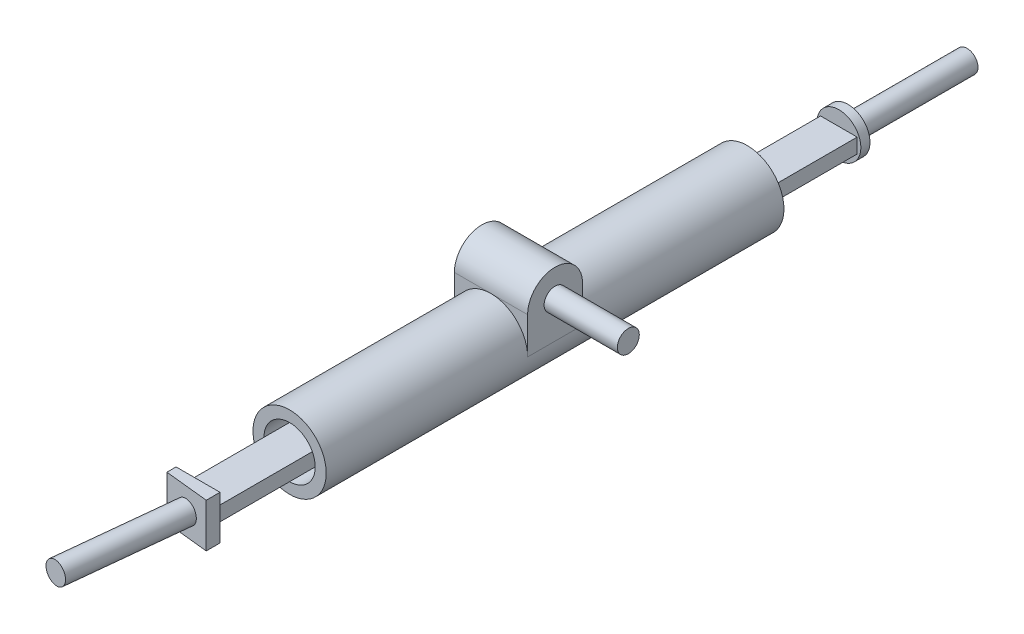
ISO-10303-21;
HEADER;
FILE_DESCRIPTION(('STEP AP214'),'2;1');
FILE_NAME('part.step','',(''),(''),'','','');
FILE_SCHEMA(('AUTOMOTIVE_DESIGN { 1 0 10303 214 1 1 1 1 }'));
ENDSEC;
DATA;
#1=APPLICATION_CONTEXT('core data for automotive mechanical design processes');
#2=APPLICATION_PROTOCOL_DEFINITION('international standard','automotive_design',2000,#1);
#3=PRODUCT_CONTEXT('',#1,'mechanical');
#4=PRODUCT('Part','Part','',(#3));
#5=PRODUCT_RELATED_PRODUCT_CATEGORY('part','',(#4));
#6=PRODUCT_DEFINITION_FORMATION('','',#4);
#7=PRODUCT_DEFINITION_CONTEXT('part definition',#1,'design');
#8=PRODUCT_DEFINITION('design','',#6,#7);
#9=PRODUCT_DEFINITION_SHAPE('','',#8);
#10=(LENGTH_UNIT() NAMED_UNIT(*) SI_UNIT(.MILLI.,.METRE.));
#11=(NAMED_UNIT(*) PLANE_ANGLE_UNIT() SI_UNIT($,.RADIAN.));
#12=(NAMED_UNIT(*) SI_UNIT($,.STERADIAN.) SOLID_ANGLE_UNIT());
#13=UNCERTAINTY_MEASURE_WITH_UNIT(LENGTH_MEASURE(1.E-05),#10,'distance_accuracy_value','');
#14=(GEOMETRIC_REPRESENTATION_CONTEXT(3) GLOBAL_UNCERTAINTY_ASSIGNED_CONTEXT((#13)) GLOBAL_UNIT_ASSIGNED_CONTEXT((#10,
#11,#12)) REPRESENTATION_CONTEXT('',''));
#15=CARTESIAN_POINT('',(0.,0.,0.));
#16=DIRECTION('',(0.,0.,1.));
#17=DIRECTION('',(1.,0.,0.));
#18=AXIS2_PLACEMENT_3D('',#15,#16,#17);
#19=CARTESIAN_POINT('',(-20.,0.,0.));
#20=DIRECTION('',(-1.,0.,0.));
#21=DIRECTION('',(0.,0.,1.));
#22=AXIS2_PLACEMENT_3D('',#19,#20,#21);
#23=PLANE('',#22);
#24=CARTESIAN_POINT('',(-20.,20.,175.));
#25=DIRECTION('',(1.,0.,0.));
#26=DIRECTION('',(0.,0.,-1.));
#27=AXIS2_PLACEMENT_3D('',#24,#25,#26);
#28=CIRCLE('',#27,15.);
#29=CARTESIAN_POINT('',(-20.,20.,160.));
#30=VERTEX_POINT('',#29);
#31=CARTESIAN_POINT('',(-20.,20.,190.));
#32=VERTEX_POINT('',#31);
#33=EDGE_CURVE('E162',#30,#32,#28,.T.);
#34=ORIENTED_EDGE('',*,*,#33,.F.);
#35=DIRECTION('',(0.,-1.,0.));
#36=VECTOR('',#35,1.);
#37=CARTESIAN_POINT('',(-20.,35.,160.));
#38=LINE('',#37,#36);
#39=CARTESIAN_POINT('',(-20.,0.,160.));
#40=VERTEX_POINT('',#39);
#41=EDGE_CURVE('E166',#30,#40,#38,.T.);
#42=ORIENTED_EDGE('',*,*,#41,.T.);
#43=DIRECTION('',(0.,0.,1.));
#44=VECTOR('',#43,1.);
#45=CARTESIAN_POINT('',(-20.,0.,160.));
#46=LINE('',#45,#44);
#47=CARTESIAN_POINT('',(-20.,0.,190.));
#48=VERTEX_POINT('',#47);
#49=EDGE_CURVE('E184',#40,#48,#46,.T.);
#50=ORIENTED_EDGE('',*,*,#49,.T.);
#51=DIRECTION('',(0.,1.,0.));
#52=VECTOR('',#51,1.);
#53=CARTESIAN_POINT('',(-20.,0.,190.));
#54=LINE('',#53,#52);
#55=EDGE_CURVE('E169',#48,#32,#54,.T.);
#56=ORIENTED_EDGE('',*,*,#55,.T.);
#57=EDGE_LOOP('',(#34,#42,#50,#56));
#58=FACE_BOUND('',#57,.T.);
#59=ADVANCED_FACE('F32',(#58),#23,.T.);
#60=CARTESIAN_POINT('',(20.,0.,0.));
#61=DIRECTION('',(-1.,0.,0.));
#62=DIRECTION('',(0.,0.,1.));
#63=AXIS2_PLACEMENT_3D('',#60,#61,#62);
#64=PLANE('',#63);
#65=CARTESIAN_POINT('',(20.,20.,175.));
#66=DIRECTION('',(-1.,0.,0.));
#67=DIRECTION('',(0.,0.,1.));
#68=AXIS2_PLACEMENT_3D('',#65,#66,#67);
#69=CIRCLE('',#68,6.00000000000002);
#70=CARTESIAN_POINT('',(20.,20.,181.));
#71=VERTEX_POINT('',#70);
#72=EDGE_CURVE('E11',#71,#71,#69,.F.);
#73=ORIENTED_EDGE('',*,*,#72,.F.);
#74=EDGE_LOOP('',(#73));
#75=FACE_BOUND('',#74,.T.);
#76=DIRECTION('',(0.,-1.,0.));
#77=VECTOR('',#76,1.);
#78=CARTESIAN_POINT('',(20.,35.,160.));
#79=LINE('',#78,#77);
#80=CARTESIAN_POINT('',(20.,20.,160.));
#81=VERTEX_POINT('',#80);
#82=CARTESIAN_POINT('',(20.,0.,160.));
#83=VERTEX_POINT('',#82);
#84=EDGE_CURVE('E316',#81,#83,#79,.T.);
#85=ORIENTED_EDGE('',*,*,#84,.F.);
#86=CARTESIAN_POINT('',(20.,20.,175.));
#87=DIRECTION('',(1.,0.,0.));
#88=DIRECTION('',(0.,0.,-1.));
#89=AXIS2_PLACEMENT_3D('',#86,#87,#88);
#90=CIRCLE('',#89,15.);
#91=CARTESIAN_POINT('',(20.,20.,190.));
#92=VERTEX_POINT('',#91);
#93=EDGE_CURVE('E170',#81,#92,#90,.T.);
#94=ORIENTED_EDGE('',*,*,#93,.T.);
#95=DIRECTION('',(0.,1.,0.));
#96=VECTOR('',#95,1.);
#97=CARTESIAN_POINT('',(20.,0.,190.));
#98=LINE('',#97,#96);
#99=CARTESIAN_POINT('',(20.,0.,190.));
#100=VERTEX_POINT('',#99);
#101=EDGE_CURVE('E185',#100,#92,#98,.T.);
#102=ORIENTED_EDGE('',*,*,#101,.F.);
#103=DIRECTION('',(0.,0.,1.));
#104=VECTOR('',#103,1.);
#105=CARTESIAN_POINT('',(20.,0.,160.));
#106=LINE('',#105,#104);
#107=EDGE_CURVE('E189',#83,#100,#106,.T.);
#108=ORIENTED_EDGE('',*,*,#107,.F.);
#109=EDGE_LOOP('',(#85,#94,#102,#108));
#110=FACE_BOUND('',#109,.T.);
#111=ADVANCED_FACE('F322',(#75,#110),#64,.F.);
#112=CARTESIAN_POINT('',(-20.,35.,160.));
#113=DIRECTION('',(0.,0.,1.));
#114=DIRECTION('',(1.,0.,0.));
#115=AXIS2_PLACEMENT_3D('',#112,#113,#114);
#116=PLANE('',#115);
#117=ORIENTED_EDGE('',*,*,#41,.F.);
#118=DIRECTION('',(1.,0.,0.));
#119=VECTOR('',#118,1.);
#120=CARTESIAN_POINT('',(-20.,20.,160.));
#121=LINE('',#120,#119);
#122=CARTESIAN_POINT('',(0.,20.,160.));
#123=VERTEX_POINT('',#122);
#124=EDGE_CURVE('E173',#30,#123,#121,.T.);
#125=ORIENTED_EDGE('',*,*,#124,.T.);
#126=CARTESIAN_POINT('',(0.,0.,160.));
#127=DIRECTION('',(0.,0.,1.));
#128=DIRECTION('',(1.,0.,0.));
#129=AXIS2_PLACEMENT_3D('',#126,#127,#128);
#130=CIRCLE('',#129,20.);
#131=EDGE_CURVE('E182',#40,#123,#130,.F.);
#132=ORIENTED_EDGE('',*,*,#131,.F.);
#133=EDGE_LOOP('',(#117,#125,#132));
#134=FACE_BOUND('',#133,.T.);
#135=ADVANCED_FACE('F180',(#134),#116,.F.);
#136=CARTESIAN_POINT('',(-20.,0.,190.));
#137=DIRECTION('',(0.,0.,-1.));
#138=DIRECTION('',(-1.,0.,0.));
#139=AXIS2_PLACEMENT_3D('',#136,#137,#138);
#140=PLANE('',#139);
#141=DIRECTION('',(1.,0.,0.));
#142=VECTOR('',#141,1.);
#143=CARTESIAN_POINT('',(-20.,20.,190.));
#144=LINE('',#143,#142);
#145=CARTESIAN_POINT('',(0.,20.,190.));
#146=VERTEX_POINT('',#145);
#147=EDGE_CURVE('E47',#32,#146,#144,.T.);
#148=ORIENTED_EDGE('',*,*,#147,.F.);
#149=ORIENTED_EDGE('',*,*,#55,.F.);
#150=CARTESIAN_POINT('',(0.,0.,190.));
#151=DIRECTION('',(0.,0.,-1.));
#152=DIRECTION('',(-1.,0.,0.));
#153=AXIS2_PLACEMENT_3D('',#150,#151,#152);
#154=CIRCLE('',#153,20.);
#155=EDGE_CURVE('E337',#146,#48,#154,.F.);
#156=ORIENTED_EDGE('',*,*,#155,.F.);
#157=EDGE_LOOP('',(#148,#149,#156));
#158=FACE_BOUND('',#157,.T.);
#159=ADVANCED_FACE('F369',(#158),#140,.F.);
#160=DIRECTION('',(1.,0.,0.));
#161=VECTOR('',#160,1.);
#162=CARTESIAN_POINT('',(-20.,20.,190.));
#163=LINE('',#162,#161);
#164=EDGE_CURVE('E312',#146,#92,#163,.T.);
#165=ORIENTED_EDGE('',*,*,#164,.F.);
#166=EDGE_CURVE('E334',#100,#146,#154,.F.);
#167=ORIENTED_EDGE('',*,*,#166,.F.);
#168=ORIENTED_EDGE('',*,*,#101,.T.);
#169=EDGE_LOOP('',(#165,#167,#168));
#170=FACE_BOUND('',#169,.T.);
#171=ADVANCED_FACE('F379',(#170),#140,.F.);
#172=DIRECTION('',(1.,0.,0.));
#173=VECTOR('',#172,1.);
#174=CARTESIAN_POINT('',(-20.,0.,160.));
#175=LINE('',#174,#173);
#176=CARTESIAN_POINT('',(-14.,0.,160.));
#177=VERTEX_POINT('',#176);
#178=CARTESIAN_POINT('',(-10.,0.,160.));
#179=VERTEX_POINT('',#178);
#180=EDGE_CURVE('E198',#177,#179,#175,.T.);
#181=ORIENTED_EDGE('',*,*,#180,.F.);
#182=CARTESIAN_POINT('',(0.,0.,160.));
#183=DIRECTION('',(0.,0.,1.));
#184=DIRECTION('',(1.,0.,0.));
#185=AXIS2_PLACEMENT_3D('',#182,#183,#184);
#186=CIRCLE('',#185,14.);
#187=CARTESIAN_POINT('',(14.,0.,160.));
#188=VERTEX_POINT('',#187);
#189=EDGE_CURVE('E324',#177,#188,#186,.F.);
#190=ORIENTED_EDGE('',*,*,#189,.T.);
#191=CARTESIAN_POINT('',(10.,0.,160.));
#192=VERTEX_POINT('',#191);
#193=EDGE_CURVE('E197',#192,#188,#175,.T.);
#194=ORIENTED_EDGE('',*,*,#193,.F.);
#195=DIRECTION('',(0.,1.,0.));
#196=VECTOR('',#195,1.);
#197=CARTESIAN_POINT('',(10.,-4.,160.));
#198=LINE('',#197,#196);
#199=CARTESIAN_POINT('',(10.,4.,160.));
#200=VERTEX_POINT('',#199);
#201=EDGE_CURVE('E212',#192,#200,#198,.T.);
#202=ORIENTED_EDGE('',*,*,#201,.T.);
#203=DIRECTION('',(-1.,0.,0.));
#204=VECTOR('',#203,1.);
#205=CARTESIAN_POINT('',(-10.,4.,160.));
#206=LINE('',#205,#204);
#207=CARTESIAN_POINT('',(-10.,4.,160.));
#208=VERTEX_POINT('',#207);
#209=EDGE_CURVE('E209',#200,#208,#206,.T.);
#210=ORIENTED_EDGE('',*,*,#209,.T.);
#211=DIRECTION('',(0.,-1.,0.));
#212=VECTOR('',#211,1.);
#213=CARTESIAN_POINT('',(-10.,-4.,160.));
#214=LINE('',#213,#212);
#215=EDGE_CURVE('E307',#208,#179,#214,.T.);
#216=ORIENTED_EDGE('',*,*,#215,.T.);
#217=EDGE_LOOP('',(#181,#190,#194,#202,#210,#216));
#218=FACE_BOUND('',#217,.T.);
#219=ADVANCED_FACE('F371',(#218),#116,.F.);
#220=DIRECTION('',(1.,0.,0.));
#221=VECTOR('',#220,1.);
#222=CARTESIAN_POINT('',(-20.,0.,190.));
#223=LINE('',#222,#221);
#224=CARTESIAN_POINT('',(10.,0.,190.));
#225=VERTEX_POINT('',#224);
#226=CARTESIAN_POINT('',(14.,0.,190.));
#227=VERTEX_POINT('',#226);
#228=EDGE_CURVE('E194',#225,#227,#223,.T.);
#229=ORIENTED_EDGE('',*,*,#228,.T.);
#230=CARTESIAN_POINT('',(0.,0.,190.));
#231=DIRECTION('',(0.,0.,-1.));
#232=DIRECTION('',(-1.,0.,0.));
#233=AXIS2_PLACEMENT_3D('',#230,#231,#232);
#234=CIRCLE('',#233,14.);
#235=CARTESIAN_POINT('',(-14.,0.,190.));
#236=VERTEX_POINT('',#235);
#237=EDGE_CURVE('E310',#227,#236,#234,.F.);
#238=ORIENTED_EDGE('',*,*,#237,.T.);
#239=CARTESIAN_POINT('',(-10.,0.,190.));
#240=VERTEX_POINT('',#239);
#241=EDGE_CURVE('E195',#236,#240,#223,.T.);
#242=ORIENTED_EDGE('',*,*,#241,.T.);
#243=DIRECTION('',(0.,1.,0.));
#244=VECTOR('',#243,1.);
#245=CARTESIAN_POINT('',(-10.,-4.,190.));
#246=LINE('',#245,#244);
#247=CARTESIAN_POINT('',(-10.,4.,190.));
#248=VERTEX_POINT('',#247);
#249=EDGE_CURVE('E301',#240,#248,#246,.T.);
#250=ORIENTED_EDGE('',*,*,#249,.T.);
#251=DIRECTION('',(1.,0.,0.));
#252=VECTOR('',#251,1.);
#253=CARTESIAN_POINT('',(-10.,4.,190.));
#254=LINE('',#253,#252);
#255=CARTESIAN_POINT('',(10.,4.,190.));
#256=VERTEX_POINT('',#255);
#257=EDGE_CURVE('E200',#248,#256,#254,.T.);
#258=ORIENTED_EDGE('',*,*,#257,.T.);
#259=DIRECTION('',(0.,-1.,0.));
#260=VECTOR('',#259,1.);
#261=CARTESIAN_POINT('',(10.,-4.,190.));
#262=LINE('',#261,#260);
#263=EDGE_CURVE('E203',#256,#225,#262,.T.);
#264=ORIENTED_EDGE('',*,*,#263,.T.);
#265=EDGE_LOOP('',(#229,#238,#242,#250,#258,#264));
#266=FACE_BOUND('',#265,.T.);
#267=ADVANCED_FACE('F381',(#266),#140,.F.);
#268=CARTESIAN_POINT('',(10.,-4.,350.));
#269=DIRECTION('',(-1.,0.,0.));
#270=DIRECTION('',(0.,0.,1.));
#271=AXIS2_PLACEMENT_3D('',#268,#269,#270);
#272=PLANE('',#271);
#273=ORIENTED_EDGE('',*,*,#201,.F.);
#274=DIRECTION('',(0.,0.,-1.));
#275=VECTOR('',#274,1.);
#276=CARTESIAN_POINT('',(10.,0.,350.));
#277=LINE('',#276,#275);
#278=EDGE_CURVE('E206',#225,#192,#277,.T.);
#279=ORIENTED_EDGE('',*,*,#278,.F.);
#280=ORIENTED_EDGE('',*,*,#263,.F.);
#281=DIRECTION('',(0.,0.,-1.));
#282=VECTOR('',#281,1.);
#283=CARTESIAN_POINT('',(10.,4.,350.));
#284=LINE('',#283,#282);
#285=CARTESIAN_POINT('',(10.,4.,350.));
#286=VERTEX_POINT('',#285);
#287=EDGE_CURVE('E216',#286,#256,#284,.T.);
#288=ORIENTED_EDGE('',*,*,#287,.F.);
#289=DIRECTION('',(0.,1.,0.));
#290=VECTOR('',#289,1.);
#291=CARTESIAN_POINT('',(10.,-4.,350.));
#292=LINE('',#291,#290);
#293=CARTESIAN_POINT('',(10.,-4.,350.));
#294=VERTEX_POINT('',#293);
#295=EDGE_CURVE('E245',#294,#286,#292,.T.);
#296=ORIENTED_EDGE('',*,*,#295,.F.);
#297=DIRECTION('',(0.,0.,-1.));
#298=VECTOR('',#297,1.);
#299=CARTESIAN_POINT('',(10.,-4.,350.));
#300=LINE('',#299,#298);
#301=CARTESIAN_POINT('',(10.,-4.,0.));
#302=VERTEX_POINT('',#301);
#303=EDGE_CURVE('E229',#294,#302,#300,.T.);
#304=ORIENTED_EDGE('',*,*,#303,.T.);
#305=DIRECTION('',(0.,1.,0.));
#306=VECTOR('',#305,1.);
#307=CARTESIAN_POINT('',(10.,-4.,0.));
#308=LINE('',#307,#306);
#309=CARTESIAN_POINT('',(10.,4.,0.));
#310=VERTEX_POINT('',#309);
#311=EDGE_CURVE('E233',#302,#310,#308,.T.);
#312=ORIENTED_EDGE('',*,*,#311,.T.);
#313=EDGE_CURVE('E220',#200,#310,#284,.T.);
#314=ORIENTED_EDGE('',*,*,#313,.F.);
#315=EDGE_LOOP('',(#273,#279,#280,#288,#296,#304,#312,#314));
#316=FACE_BOUND('',#315,.T.);
#317=ADVANCED_FACE('F389',(#316),#272,.F.);
#318=CARTESIAN_POINT('',(-10.,4.,350.));
#319=DIRECTION('',(0.,-1.,0.));
#320=DIRECTION('',(0.,0.,-1.));
#321=AXIS2_PLACEMENT_3D('',#318,#319,#320);
#322=PLANE('',#321);
#323=ORIENTED_EDGE('',*,*,#209,.F.);
#324=ORIENTED_EDGE('',*,*,#313,.T.);
#325=DIRECTION('',(-1.,0.,0.));
#326=VECTOR('',#325,1.);
#327=CARTESIAN_POINT('',(-10.,4.,0.));
#328=LINE('',#327,#326);
#329=CARTESIAN_POINT('',(-10.,4.,0.));
#330=VERTEX_POINT('',#329);
#331=EDGE_CURVE('E232',#310,#330,#328,.T.);
#332=ORIENTED_EDGE('',*,*,#331,.T.);
#333=DIRECTION('',(0.,0.,-1.));
#334=VECTOR('',#333,1.);
#335=CARTESIAN_POINT('',(-10.,4.,350.));
#336=LINE('',#335,#334);
#337=EDGE_CURVE('E224',#208,#330,#336,.T.);
#338=ORIENTED_EDGE('',*,*,#337,.F.);
#339=EDGE_LOOP('',(#323,#324,#332,#338));
#340=FACE_BOUND('',#339,.T.);
#341=ADVANCED_FACE('F392',(#340),#322,.F.);
#342=ORIENTED_EDGE('',*,*,#257,.F.);
#343=CARTESIAN_POINT('',(-10.,4.,350.));
#344=VERTEX_POINT('',#343);
#345=EDGE_CURVE('E221',#344,#248,#336,.T.);
#346=ORIENTED_EDGE('',*,*,#345,.F.);
#347=DIRECTION('',(-1.,0.,0.));
#348=VECTOR('',#347,1.);
#349=CARTESIAN_POINT('',(-10.,4.,350.));
#350=LINE('',#349,#348);
#351=EDGE_CURVE('E250',#286,#344,#350,.T.);
#352=ORIENTED_EDGE('',*,*,#351,.F.);
#353=ORIENTED_EDGE('',*,*,#287,.T.);
#354=EDGE_LOOP('',(#342,#346,#352,#353));
#355=FACE_BOUND('',#354,.T.);
#356=ADVANCED_FACE('F396',(#355),#322,.F.);
#357=CARTESIAN_POINT('',(-10.,-4.,350.));
#358=DIRECTION('',(1.,0.,0.));
#359=DIRECTION('',(0.,0.,-1.));
#360=AXIS2_PLACEMENT_3D('',#357,#358,#359);
#361=PLANE('',#360);
#362=ORIENTED_EDGE('',*,*,#215,.F.);
#363=ORIENTED_EDGE('',*,*,#337,.T.);
#364=DIRECTION('',(0.,-1.,0.));
#365=VECTOR('',#364,1.);
#366=CARTESIAN_POINT('',(-10.,-4.,0.));
#367=LINE('',#366,#365);
#368=CARTESIAN_POINT('',(-10.,-4.,0.));
#369=VERTEX_POINT('',#368);
#370=EDGE_CURVE('E219',#330,#369,#367,.T.);
#371=ORIENTED_EDGE('',*,*,#370,.T.);
#372=DIRECTION('',(0.,0.,-1.));
#373=VECTOR('',#372,1.);
#374=CARTESIAN_POINT('',(-10.,-4.,350.));
#375=LINE('',#374,#373);
#376=CARTESIAN_POINT('',(-10.,-4.,350.));
#377=VERTEX_POINT('',#376);
#378=EDGE_CURVE('E225',#377,#369,#375,.T.);
#379=ORIENTED_EDGE('',*,*,#378,.F.);
#380=DIRECTION('',(0.,-1.,0.));
#381=VECTOR('',#380,1.);
#382=CARTESIAN_POINT('',(-10.,-4.,350.));
#383=LINE('',#382,#381);
#384=EDGE_CURVE('E246',#344,#377,#383,.T.);
#385=ORIENTED_EDGE('',*,*,#384,.F.);
#386=ORIENTED_EDGE('',*,*,#345,.T.);
#387=ORIENTED_EDGE('',*,*,#249,.F.);
#388=DIRECTION('',(0.,0.,1.));
#389=VECTOR('',#388,1.);
#390=CARTESIAN_POINT('',(-10.,0.,350.));
#391=LINE('',#390,#389);
#392=EDGE_CURVE('E304',#179,#240,#391,.T.);
#393=ORIENTED_EDGE('',*,*,#392,.F.);
#394=EDGE_LOOP('',(#362,#363,#371,#379,#385,#386,#387,#393));
#395=FACE_BOUND('',#394,.T.);
#396=ADVANCED_FACE('F398',(#395),#361,.F.);
#397=CARTESIAN_POINT('',(0.,0.,350.));
#398=DIRECTION('',(0.,0.,1.));
#399=DIRECTION('',(1.,0.,0.));
#400=AXIS2_PLACEMENT_3D('',#397,#398,#399);
#401=PLANE('',#400);
#402=DIRECTION('',(1.,0.,0.));
#403=VECTOR('',#402,1.);
#404=CARTESIAN_POINT('',(-10.,-4.,350.));
#405=LINE('',#404,#403);
#406=EDGE_CURVE('E215',#377,#294,#405,.T.);
#407=ORIENTED_EDGE('',*,*,#406,.T.);
#408=ORIENTED_EDGE('',*,*,#295,.T.);
#409=ORIENTED_EDGE('',*,*,#351,.T.);
#410=ORIENTED_EDGE('',*,*,#384,.T.);
#411=EDGE_LOOP('',(#407,#408,#409,#410));
#412=FACE_BOUND('',#411,.T.);
#413=DIRECTION('',(-1.,0.,0.));
#414=VECTOR('',#413,1.);
#415=CARTESIAN_POINT('',(-12.,12.,350.));
#416=LINE('',#415,#414);
#417=CARTESIAN_POINT('',(12.,12.,350.));
#418=VERTEX_POINT('',#417);
#419=CARTESIAN_POINT('',(-12.,12.,350.));
#420=VERTEX_POINT('',#419);
#421=EDGE_CURVE('E279',#418,#420,#416,.T.);
#422=ORIENTED_EDGE('',*,*,#421,.F.);
#423=DIRECTION('',(0.,1.,0.));
#424=VECTOR('',#423,1.);
#425=CARTESIAN_POINT('',(12.,-12.,350.));
#426=LINE('',#425,#424);
#427=CARTESIAN_POINT('',(12.,-12.,350.));
#428=VERTEX_POINT('',#427);
#429=EDGE_CURVE('E267',#428,#418,#426,.T.);
#430=ORIENTED_EDGE('',*,*,#429,.F.);
#431=DIRECTION('',(-1.,0.,0.));
#432=VECTOR('',#431,1.);
#433=CARTESIAN_POINT('',(-12.,-12.,350.));
#434=LINE('',#433,#432);
#435=CARTESIAN_POINT('',(-12.,-12.,350.));
#436=VERTEX_POINT('',#435);
#437=EDGE_CURVE('E249',#428,#436,#434,.T.);
#438=ORIENTED_EDGE('',*,*,#437,.T.);
#439=DIRECTION('',(0.,1.,0.));
#440=VECTOR('',#439,1.);
#441=CARTESIAN_POINT('',(-12.,-12.,350.));
#442=LINE('',#441,#440);
#443=EDGE_CURVE('E242',#436,#420,#442,.T.);
#444=ORIENTED_EDGE('',*,*,#443,.T.);
#445=EDGE_LOOP('',(#422,#430,#438,#444));
#446=FACE_BOUND('',#445,.T.);
#447=ADVANCED_FACE('F401',(#412,#446),#401,.F.);
#448=CARTESIAN_POINT('',(-10.,-4.,350.));
#449=DIRECTION('',(0.,1.,0.));
#450=DIRECTION('',(0.,0.,1.));
#451=AXIS2_PLACEMENT_3D('',#448,#449,#450);
#452=PLANE('',#451);
#453=DIRECTION('',(1.,0.,0.));
#454=VECTOR('',#453,1.);
#455=CARTESIAN_POINT('',(-10.,-4.,0.));
#456=LINE('',#455,#454);
#457=EDGE_CURVE('E223',#369,#302,#456,.T.);
#458=ORIENTED_EDGE('',*,*,#457,.T.);
#459=ORIENTED_EDGE('',*,*,#303,.F.);
#460=ORIENTED_EDGE('',*,*,#406,.F.);
#461=ORIENTED_EDGE('',*,*,#378,.T.);
#462=EDGE_LOOP('',(#458,#459,#460,#461));
#463=FACE_BOUND('',#462,.T.);
#464=ADVANCED_FACE('F403',(#463),#452,.F.);
#465=CARTESIAN_POINT('',(0.,0.,-5.));
#466=DIRECTION('',(0.,0.,1.));
#467=DIRECTION('',(1.,0.,0.));
#468=AXIS2_PLACEMENT_3D('',#465,#466,#467);
#469=CYLINDRICAL_SURFACE('',#468,12.);
#470=CARTESIAN_POINT('',(0.,0.,-5.));
#471=DIRECTION('',(0.,0.,-1.));
#472=DIRECTION('',(-1.,0.,0.));
#473=AXIS2_PLACEMENT_3D('',#470,#471,#472);
#474=CIRCLE('',#473,12.);
#475=CARTESIAN_POINT('',(-12.,0.,-5.));
#476=VERTEX_POINT('',#475);
#477=EDGE_CURVE('E257',#476,#476,#474,.T.);
#478=ORIENTED_EDGE('',*,*,#477,.F.);
#479=EDGE_LOOP('',(#478));
#480=FACE_BOUND('',#479,.T.);
#481=CARTESIAN_POINT('',(0.,0.,0.));
#482=DIRECTION('',(0.,0.,-1.));
#483=DIRECTION('',(-1.,0.,0.));
#484=AXIS2_PLACEMENT_3D('',#481,#482,#483);
#485=CIRCLE('',#484,12.);
#486=CARTESIAN_POINT('',(-12.,0.,0.));
#487=VERTEX_POINT('',#486);
#488=EDGE_CURVE('E228',#487,#487,#485,.T.);
#489=ORIENTED_EDGE('',*,*,#488,.T.);
#490=EDGE_LOOP('',(#489));
#491=FACE_BOUND('',#490,.T.);
#492=ADVANCED_FACE('F406',(#480,#491),#469,.T.);
#493=CARTESIAN_POINT('',(0.,0.,-5.));
#494=DIRECTION('',(0.,0.,-1.));
#495=DIRECTION('',(-1.,0.,0.));
#496=AXIS2_PLACEMENT_3D('',#493,#494,#495);
#497=PLANE('',#496);
#498=CARTESIAN_POINT('',(0.,0.,-5.));
#499=DIRECTION('',(0.,0.,-1.));
#500=DIRECTION('',(-1.,0.,0.));
#501=AXIS2_PLACEMENT_3D('',#498,#499,#500);
#502=CIRCLE('',#501,6.);
#503=CARTESIAN_POINT('',(-6.,0.,-5.));
#504=VERTEX_POINT('',#503);
#505=EDGE_CURVE('E295',#504,#504,#502,.T.);
#506=ORIENTED_EDGE('',*,*,#505,.F.);
#507=EDGE_LOOP('',(#506));
#508=FACE_BOUND('',#507,.T.);
#509=ORIENTED_EDGE('',*,*,#477,.T.);
#510=EDGE_LOOP('',(#509));
#511=FACE_BOUND('',#510,.T.);
#512=ADVANCED_FACE('F413',(#508,#511),#497,.T.);
#513=CARTESIAN_POINT('',(0.,0.,0.));
#514=DIRECTION('',(0.,0.,-1.));
#515=DIRECTION('',(-1.,0.,0.));
#516=AXIS2_PLACEMENT_3D('',#513,#514,#515);
#517=PLANE('',#516);
#518=ORIENTED_EDGE('',*,*,#311,.F.);
#519=ORIENTED_EDGE('',*,*,#457,.F.);
#520=ORIENTED_EDGE('',*,*,#370,.F.);
#521=ORIENTED_EDGE('',*,*,#331,.F.);
#522=EDGE_LOOP('',(#518,#519,#520,#521));
#523=FACE_BOUND('',#522,.T.);
#524=ORIENTED_EDGE('',*,*,#488,.F.);
#525=EDGE_LOOP('',(#524));
#526=FACE_BOUND('',#525,.T.);
#527=ADVANCED_FACE('F415',(#523,#526),#517,.F.);
#528=CARTESIAN_POINT('',(-12.,-12.,350.));
#529=DIRECTION('',(-1.,0.,0.));
#530=DIRECTION('',(0.,0.,1.));
#531=AXIS2_PLACEMENT_3D('',#528,#529,#530);
#532=PLANE('',#531);
#533=ORIENTED_EDGE('',*,*,#443,.F.);
#534=DIRECTION('',(0.,0.,1.));
#535=VECTOR('',#534,1.);
#536=CARTESIAN_POINT('',(-12.,-12.,350.));
#537=LINE('',#536,#535);
#538=CARTESIAN_POINT('',(-12.,-12.,355.));
#539=VERTEX_POINT('',#538);
#540=EDGE_CURVE('E260',#436,#539,#537,.T.);
#541=ORIENTED_EDGE('',*,*,#540,.T.);
#542=DIRECTION('',(0.,1.,0.));
#543=VECTOR('',#542,1.);
#544=CARTESIAN_POINT('',(-12.,-12.,355.));
#545=LINE('',#544,#543);
#546=CARTESIAN_POINT('',(-12.,12.,355.));
#547=VERTEX_POINT('',#546);
#548=EDGE_CURVE('E261',#539,#547,#545,.T.);
#549=ORIENTED_EDGE('',*,*,#548,.T.);
#550=DIRECTION('',(0.,0.,1.));
#551=VECTOR('',#550,1.);
#552=CARTESIAN_POINT('',(-12.,12.,350.));
#553=LINE('',#552,#551);
#554=EDGE_CURVE('E281',#420,#547,#553,.T.);
#555=ORIENTED_EDGE('',*,*,#554,.F.);
#556=EDGE_LOOP('',(#533,#541,#549,#555));
#557=FACE_BOUND('',#556,.T.);
#558=ADVANCED_FACE('F418',(#557),#532,.T.);
#559=CARTESIAN_POINT('',(12.,-12.,350.));
#560=DIRECTION('',(1.,0.,0.));
#561=DIRECTION('',(0.,0.,-1.));
#562=AXIS2_PLACEMENT_3D('',#559,#560,#561);
#563=PLANE('',#562);
#564=DIRECTION('',(0.,0.,-1.));
#565=VECTOR('',#564,1.);
#566=CARTESIAN_POINT('',(12.,-12.,350.));
#567=LINE('',#566,#565);
#568=CARTESIAN_POINT('',(12.,-12.,357.522501646376));
#569=VERTEX_POINT('',#568);
#570=EDGE_CURVE('E263',#569,#428,#567,.T.);
#571=ORIENTED_EDGE('',*,*,#570,.T.);
#572=ORIENTED_EDGE('',*,*,#429,.T.);
#573=DIRECTION('',(0.,0.,-1.));
#574=VECTOR('',#573,1.);
#575=CARTESIAN_POINT('',(12.,12.,350.));
#576=LINE('',#575,#574);
#577=CARTESIAN_POINT('',(12.,12.,357.522501646376));
#578=VERTEX_POINT('',#577);
#579=EDGE_CURVE('E276',#578,#418,#576,.T.);
#580=ORIENTED_EDGE('',*,*,#579,.F.);
#581=DIRECTION('',(0.,1.,0.));
#582=VECTOR('',#581,1.);
#583=CARTESIAN_POINT('',(12.,-12.,357.522501646376));
#584=LINE('',#583,#582);
#585=EDGE_CURVE('E264',#569,#578,#584,.T.);
#586=ORIENTED_EDGE('',*,*,#585,.F.);
#587=EDGE_LOOP('',(#571,#572,#580,#586));
#588=FACE_BOUND('',#587,.T.);
#589=ADVANCED_FACE('F425',(#588),#563,.T.);
#590=CARTESIAN_POINT('',(-12.,-12.,355.));
#591=DIRECTION('',(-0.104528463267654,0.,0.994521895368273));
#592=DIRECTION('',(0.994521895368273,0.,0.104528463267654));
#593=AXIS2_PLACEMENT_3D('',#590,#591,#592);
#594=PLANE('',#593);
#595=CARTESIAN_POINT('',(0.,0.,356.261250823188));
#596=DIRECTION('',(-0.104528463267654,0.,0.994521895368273));
#597=DIRECTION('',(0.994521895368273,0.,0.104528463267654));
#598=AXIS2_PLACEMENT_3D('',#595,#596,#597);
#599=CIRCLE('',#598,6.);
#600=CARTESIAN_POINT('',(-5.96713137220964,0.,355.634080043582));
#601=VERTEX_POINT('',#600);
#602=EDGE_CURVE('E287',#601,#601,#599,.T.);
#603=ORIENTED_EDGE('',*,*,#602,.F.);
#604=EDGE_LOOP('',(#603));
#605=FACE_BOUND('',#604,.T.);
#606=ORIENTED_EDGE('',*,*,#585,.T.);
#607=DIRECTION('',(0.994521895368273,0.,0.104528463267654));
#608=VECTOR('',#607,1.);
#609=CARTESIAN_POINT('',(-12.,12.,355.));
#610=LINE('',#609,#608);
#611=EDGE_CURVE('E284',#547,#578,#610,.T.);
#612=ORIENTED_EDGE('',*,*,#611,.F.);
#613=ORIENTED_EDGE('',*,*,#548,.F.);
#614=DIRECTION('',(0.994521895368273,0.,0.104528463267654));
#615=VECTOR('',#614,1.);
#616=CARTESIAN_POINT('',(-12.,-12.,355.));
#617=LINE('',#616,#615);
#618=EDGE_CURVE('E266',#539,#569,#617,.T.);
#619=ORIENTED_EDGE('',*,*,#618,.T.);
#620=EDGE_LOOP('',(#606,#612,#613,#619));
#621=FACE_BOUND('',#620,.T.);
#622=ADVANCED_FACE('F427',(#605,#621),#594,.T.);
#623=CARTESIAN_POINT('',(0.,-12.,0.));
#624=DIRECTION('',(0.,1.,0.));
#625=DIRECTION('',(0.,0.,1.));
#626=AXIS2_PLACEMENT_3D('',#623,#624,#625);
#627=PLANE('',#626);
#628=ORIENTED_EDGE('',*,*,#540,.F.);
#629=ORIENTED_EDGE('',*,*,#437,.F.);
#630=ORIENTED_EDGE('',*,*,#570,.F.);
#631=ORIENTED_EDGE('',*,*,#618,.F.);
#632=EDGE_LOOP('',(#628,#629,#630,#631));
#633=FACE_BOUND('',#632,.T.);
#634=ADVANCED_FACE('F430',(#633),#627,.F.);
#635=CARTESIAN_POINT('',(0.,12.,0.));
#636=DIRECTION('',(0.,1.,0.));
#637=DIRECTION('',(0.,0.,1.));
#638=AXIS2_PLACEMENT_3D('',#635,#636,#637);
#639=PLANE('',#638);
#640=ORIENTED_EDGE('',*,*,#579,.T.);
#641=ORIENTED_EDGE('',*,*,#421,.T.);
#642=ORIENTED_EDGE('',*,*,#554,.T.);
#643=ORIENTED_EDGE('',*,*,#611,.T.);
#644=EDGE_LOOP('',(#640,#641,#642,#643));
#645=FACE_BOUND('',#644,.T.);
#646=ADVANCED_FACE('F437',(#645),#639,.T.);
#647=CARTESIAN_POINT('',(-6.79435011239749,0.,420.905174022126));
#648=DIRECTION('',(0.104528463267654,0.,-0.994521895368273));
#649=DIRECTION('',(-0.994521895368273,0.,-0.104528463267654));
#650=AXIS2_PLACEMENT_3D('',#647,#648,#649);
#651=CYLINDRICAL_SURFACE('',#650,6.);
#652=CARTESIAN_POINT('',(-6.79435011239749,0.,420.905174022126));
#653=DIRECTION('',(-0.104528463267654,0.,0.994521895368273));
#654=DIRECTION('',(0.994521895368273,0.,0.104528463267654));
#655=AXIS2_PLACEMENT_3D('',#652,#653,#654);
#656=CIRCLE('',#655,6.);
#657=CARTESIAN_POINT('',(-12.7614814846071,0.,420.27800324252));
#658=VERTEX_POINT('',#657);
#659=EDGE_CURVE('E292',#658,#658,#656,.T.);
#660=CARTESIAN_POINT('',(-12.7614814846071,0.,420.27800324252));
#661=CARTESIAN_POINT('',(-12.6907070042697,0.,419.604629042531));
#662=CARTESIAN_POINT('',(-12.6199325239322,0.,418.931254842542));
#663=CARTESIAN_POINT('',(-12.4783835632572,0.,417.584506442564));
#664=CARTESIAN_POINT('',(-12.4076090829198,0.,416.911132242575));
#665=CARTESIAN_POINT('',(-12.2660601222448,0.,415.564383842597));
#666=CARTESIAN_POINT('',(-12.1952856419073,0.,414.891009642608));
#667=CARTESIAN_POINT('',(-12.0537366812324,0.,413.544261242631));
#668=CARTESIAN_POINT('',(-11.9829622008949,0.,412.870887042642));
#669=CARTESIAN_POINT('',(-11.84141324022,0.,411.524138642664));
#670=CARTESIAN_POINT('',(-11.7706387598825,0.,410.850764442675));
#671=CARTESIAN_POINT('',(-11.6290897992076,0.,409.504016042697));
#672=CARTESIAN_POINT('',(-11.5583153188701,0.,408.830641842708));
#673=CARTESIAN_POINT('',(-11.4167663581951,0.,407.48389344273));
#674=CARTESIAN_POINT('',(-11.3459918778577,0.,406.810519242741));
#675=CARTESIAN_POINT('',(-11.2044429171827,0.,405.463770842763));
#676=CARTESIAN_POINT('',(-11.1336684368452,0.,404.790396642774));
#677=CARTESIAN_POINT('',(-10.9921194761703,0.,403.443648242797));
#678=CARTESIAN_POINT('',(-10.9213449958328,0.,402.770274042808));
#679=CARTESIAN_POINT('',(-10.7797960351579,0.,401.42352564283));
#680=CARTESIAN_POINT('',(-10.7090215548204,0.,400.750151442841));
#681=CARTESIAN_POINT('',(-10.5674725941454,0.,399.403403042863));
#682=CARTESIAN_POINT('',(-10.496698113808,0.,398.730028842874));
#683=CARTESIAN_POINT('',(-10.355149153133,0.,397.383280442896));
#684=CARTESIAN_POINT('',(-10.2843746727955,0.,396.709906242907));
#685=CARTESIAN_POINT('',(-10.1428257121206,0.,395.363157842929));
#686=CARTESIAN_POINT('',(-10.0720512317831,0.,394.68978364294));
#687=CARTESIAN_POINT('',(-9.93050227110818,0.,393.343035242963));
#688=CARTESIAN_POINT('',(-9.85972779077071,0.,392.669661042974));
#689=CARTESIAN_POINT('',(-9.71817883009576,0.,391.322912642996));
#690=CARTESIAN_POINT('',(-9.64740434975828,0.,390.649538443007));
#691=CARTESIAN_POINT('',(-9.50585538908333,0.,389.302790043029));
#692=CARTESIAN_POINT('',(-9.43508090874586,0.,388.62941584304));
#693=CARTESIAN_POINT('',(-9.29353194807091,0.,387.282667443062));
#694=CARTESIAN_POINT('',(-9.22275746773344,0.,386.609293243073));
#695=CARTESIAN_POINT('',(-9.08120850705849,0.,385.262544843095));
#696=CARTESIAN_POINT('',(-9.01043402672102,0.,384.589170643106));
#697=CARTESIAN_POINT('',(-8.86888506604607,0.,383.242422243129));
#698=CARTESIAN_POINT('',(-8.7981105857086,0.,382.56904804314));
#699=CARTESIAN_POINT('',(-8.65656162503365,0.,381.222299643162));
#700=CARTESIAN_POINT('',(-8.58578714469618,0.,380.548925443173));
#701=CARTESIAN_POINT('',(-8.44423818402123,0.,379.202177043195));
#702=CARTESIAN_POINT('',(-8.37346370368375,0.,378.528802843206));
#703=CARTESIAN_POINT('',(-8.23191474300881,0.,377.182054443228));
#704=CARTESIAN_POINT('',(-8.16114026267133,0.,376.508680243239));
#705=CARTESIAN_POINT('',(-8.01959130199639,0.,375.161931843261));
#706=CARTESIAN_POINT('',(-7.94881682165891,0.,374.488557643272));
#707=CARTESIAN_POINT('',(-7.80726786098396,0.,373.141809243294));
#708=CARTESIAN_POINT('',(-7.73649338064649,0.,372.468435043306));
#709=CARTESIAN_POINT('',(-7.59494441997154,0.,371.121686643328));
#710=CARTESIAN_POINT('',(-7.52416993963407,0.,370.448312443339));
#711=CARTESIAN_POINT('',(-7.38262097895912,0.,369.101564043361));
#712=CARTESIAN_POINT('',(-7.31184649862165,0.,368.428189843372));
#713=CARTESIAN_POINT('',(-7.1702975379467,0.,367.081441443394));
#714=CARTESIAN_POINT('',(-7.09952305760922,0.,366.408067243405));
#715=CARTESIAN_POINT('',(-6.95797409693428,0.,365.061318843427));
#716=CARTESIAN_POINT('',(-6.8871996165968,0.,364.387944643438));
#717=CARTESIAN_POINT('',(-6.74565065592186,0.,363.04119624346));
#718=CARTESIAN_POINT('',(-6.67487617558438,0.,362.367822043472));
#719=CARTESIAN_POINT('',(-6.53332721490943,0.,361.021073643494));
#720=CARTESIAN_POINT('',(-6.46255273457196,0.,360.347699443505));
#721=CARTESIAN_POINT('',(-6.32100377389701,0.,359.000951043527));
#722=CARTESIAN_POINT('',(-6.25022929355954,0.,358.327576843538));
#723=CARTESIAN_POINT('',(-6.10868033288459,0.,356.98082844356));
#724=CARTESIAN_POINT('',(-6.03790585254712,0.,356.307454243571));
#725=CARTESIAN_POINT('',(-5.96713137220964,0.,355.634080043582));
#726=B_SPLINE_CURVE_WITH_KNOTS('',3,(#660,#661,#662,#663,#664,#665,#666,#667,#668,#669,#670,
#671,#672,#673,#674,#675,#676,#677,#678,#679,#680,#681,#682,#683,#684,#685,#686,#687,#688,#689,
#690,#691,#692,#693,#694,#695,#696,#697,#698,#699,#700,#701,#702,#703,#704,#705,#706,#707,#708,
#709,#710,#711,#712,#713,#714,#715,#716,#717,#718,#719,#720,#721,#722,#723,#724,#725),
.UNSPECIFIED.,.F.,.F.,(4,2,2,2,2,2,2,2,2,2,2,2,2,2,2,2,2,2,2,2,2,2,2,2,2,2,2,2,2,2,2,2,4),(0.,
2.03125000000001,4.06250000000001,6.09375000000002,8.12500000000003,10.15625,12.1875,14.21875,
16.2500000000001,18.28125,20.3125,22.34375,24.375,26.40625,28.4375,30.46875,32.5,34.53125,
36.5625,38.59375,40.625,42.65625,44.6875,46.71875,48.75,50.78125,52.8125,54.84375,56.875,
58.90625,60.9375,62.96875,65.),.UNSPECIFIED.);
#727=EDGE_CURVE('BSEAM441',#658,#601,#726,.T.);
#728=ORIENTED_EDGE('',*,*,#659,.F.);
#729=ORIENTED_EDGE('',*,*,#602,.T.);
#730=ORIENTED_EDGE('',*,*,#727,.T.);
#731=ORIENTED_EDGE('',*,*,#727,.F.);
#732=EDGE_LOOP('',(#728,#730,#729,#731));
#733=FACE_BOUND('',#732,.T.);
#734=ADVANCED_FACE('F441',(#733),#651,.T.);
#735=CARTESIAN_POINT('',(-6.79435011239749,0.,420.905174022126));
#736=DIRECTION('',(-0.104528463267654,0.,0.994521895368273));
#737=DIRECTION('',(0.994521895368273,0.,0.104528463267654));
#738=AXIS2_PLACEMENT_3D('',#735,#736,#737);
#739=PLANE('',#738);
#740=ORIENTED_EDGE('',*,*,#659,.T.);
#741=EDGE_LOOP('',(#740));
#742=FACE_BOUND('',#741,.T.);
#743=ADVANCED_FACE('F445',(#742),#739,.T.);
#744=CARTESIAN_POINT('',(0.,0.,-70.));
#745=DIRECTION('',(0.,0.,1.));
#746=DIRECTION('',(1.,0.,0.));
#747=AXIS2_PLACEMENT_3D('',#744,#745,#746);
#748=CYLINDRICAL_SURFACE('',#747,6.);
#749=CARTESIAN_POINT('',(0.,0.,-70.));
#750=DIRECTION('',(0.,0.,-1.));
#751=DIRECTION('',(-1.,0.,0.));
#752=AXIS2_PLACEMENT_3D('',#749,#750,#751);
#753=CIRCLE('',#752,6.);
#754=CARTESIAN_POINT('',(-6.,0.,-70.));
#755=VERTEX_POINT('',#754);
#756=EDGE_CURVE('E298',#755,#755,#753,.T.);
#757=ORIENTED_EDGE('',*,*,#756,.F.);
#758=EDGE_LOOP('',(#757));
#759=FACE_BOUND('',#758,.T.);
#760=ORIENTED_EDGE('',*,*,#505,.T.);
#761=EDGE_LOOP('',(#760));
#762=FACE_BOUND('',#761,.T.);
#763=ADVANCED_FACE('F448',(#759,#762),#748,.T.);
#764=CARTESIAN_POINT('',(0.,0.,-70.));
#765=DIRECTION('',(0.,0.,-1.));
#766=DIRECTION('',(-1.,0.,0.));
#767=AXIS2_PLACEMENT_3D('',#764,#765,#766);
#768=PLANE('',#767);
#769=ORIENTED_EDGE('',*,*,#756,.T.);
#770=EDGE_LOOP('',(#769));
#771=FACE_BOUND('',#770,.T.);
#772=ADVANCED_FACE('F34',(#771),#768,.T.);
#773=CARTESIAN_POINT('',(-20.,0.,160.));
#774=DIRECTION('',(0.,1.,0.));
#775=DIRECTION('',(0.,0.,1.));
#776=AXIS2_PLACEMENT_3D('',#773,#774,#775);
#777=PLANE('',#776);
#778=ORIENTED_EDGE('',*,*,#193,.T.);
#779=DIRECTION('',(0.,0.,1.));
#780=VECTOR('',#779,1.);
#781=CARTESIAN_POINT('',(14.,0.,50.));
#782=LINE('',#781,#780);
#783=EDGE_CURVE('E327',#188,#227,#782,.T.);
#784=ORIENTED_EDGE('',*,*,#783,.T.);
#785=ORIENTED_EDGE('',*,*,#228,.F.);
#786=ORIENTED_EDGE('',*,*,#278,.T.);
#787=EDGE_LOOP('',(#778,#784,#785,#786));
#788=FACE_BOUND('',#787,.T.);
#789=ADVANCED_FACE('F382',(#788),#777,.F.);
#790=ORIENTED_EDGE('',*,*,#241,.F.);
#791=DIRECTION('',(0.,0.,1.));
#792=VECTOR('',#791,1.);
#793=CARTESIAN_POINT('',(-14.,0.,50.));
#794=LINE('',#793,#792);
#795=EDGE_CURVE('E55',#236,#177,#794,.F.);
#796=ORIENTED_EDGE('',*,*,#795,.T.);
#797=ORIENTED_EDGE('',*,*,#180,.T.);
#798=ORIENTED_EDGE('',*,*,#392,.T.);
#799=EDGE_LOOP('',(#790,#796,#797,#798));
#800=FACE_BOUND('',#799,.T.);
#801=ADVANCED_FACE('F384',(#800),#777,.F.);
#802=CARTESIAN_POINT('',(0.,0.,50.));
#803=DIRECTION('',(0.,0.,1.));
#804=DIRECTION('',(1.,0.,0.));
#805=AXIS2_PLACEMENT_3D('',#802,#803,#804);
#806=CYLINDRICAL_SURFACE('',#805,14.);
#807=CARTESIAN_POINT('',(0.,0.,300.));
#808=DIRECTION('',(0.,0.,1.));
#809=DIRECTION('',(1.,0.,0.));
#810=AXIS2_PLACEMENT_3D('',#807,#808,#809);
#811=CIRCLE('',#810,14.);
#812=CARTESIAN_POINT('',(14.,0.,300.));
#813=VERTEX_POINT('',#812);
#814=EDGE_CURVE('E347',#813,#813,#811,.T.);
#815=ORIENTED_EDGE('',*,*,#814,.T.);
#816=EDGE_LOOP('',(#815));
#817=FACE_BOUND('',#816,.T.);
#818=CARTESIAN_POINT('',(0.,0.,50.));
#819=DIRECTION('',(0.,0.,-1.));
#820=DIRECTION('',(-1.,0.,0.));
#821=AXIS2_PLACEMENT_3D('',#818,#819,#820);
#822=CIRCLE('',#821,14.);
#823=CARTESIAN_POINT('',(-14.,0.,50.));
#824=VERTEX_POINT('',#823);
#825=EDGE_CURVE('E341',#824,#824,#822,.T.);
#826=ORIENTED_EDGE('',*,*,#825,.T.);
#827=EDGE_LOOP('',(#826));
#828=FACE_BOUND('',#827,.T.);
#829=ORIENTED_EDGE('',*,*,#189,.F.);
#830=ORIENTED_EDGE('',*,*,#795,.F.);
#831=ORIENTED_EDGE('',*,*,#237,.F.);
#832=ORIENTED_EDGE('',*,*,#783,.F.);
#833=EDGE_LOOP('',(#829,#830,#831,#832));
#834=FACE_BOUND('',#833,.T.);
#835=ADVANCED_FACE('F478',(#817,#828,#834),#806,.F.);
#836=CARTESIAN_POINT('',(0.,0.,50.));
#837=DIRECTION('',(0.,0.,1.));
#838=DIRECTION('',(1.,0.,0.));
#839=AXIS2_PLACEMENT_3D('',#836,#837,#838);
#840=CYLINDRICAL_SURFACE('',#839,20.);
#841=CARTESIAN_POINT('',(0.,0.,50.));
#842=DIRECTION('',(0.,0.,-1.));
#843=DIRECTION('',(-1.,0.,0.));
#844=AXIS2_PLACEMENT_3D('',#841,#842,#843);
#845=CIRCLE('',#844,20.);
#846=CARTESIAN_POINT('',(-20.,0.,50.));
#847=VERTEX_POINT('',#846);
#848=EDGE_CURVE('E338',#847,#847,#845,.T.);
#849=ORIENTED_EDGE('',*,*,#848,.F.);
#850=EDGE_LOOP('',(#849));
#851=FACE_BOUND('',#850,.T.);
#852=CARTESIAN_POINT('',(0.,0.,300.));
#853=DIRECTION('',(0.,0.,1.));
#854=DIRECTION('',(1.,0.,0.));
#855=AXIS2_PLACEMENT_3D('',#852,#853,#854);
#856=CIRCLE('',#855,20.);
#857=CARTESIAN_POINT('',(20.,0.,300.));
#858=VERTEX_POINT('',#857);
#859=EDGE_CURVE('E344',#858,#858,#856,.T.);
#860=ORIENTED_EDGE('',*,*,#859,.F.);
#861=EDGE_LOOP('',(#860));
#862=FACE_BOUND('',#861,.T.);
#863=ORIENTED_EDGE('',*,*,#49,.F.);
#864=ORIENTED_EDGE('',*,*,#131,.T.);
#865=EDGE_CURVE('E318',#123,#83,#130,.F.);
#866=ORIENTED_EDGE('',*,*,#865,.T.);
#867=ORIENTED_EDGE('',*,*,#107,.T.);
#868=ORIENTED_EDGE('',*,*,#166,.T.);
#869=ORIENTED_EDGE('',*,*,#155,.T.);
#870=EDGE_LOOP('',(#863,#864,#866,#867,#868,#869));
#871=FACE_BOUND('',#870,.T.);
#872=ADVANCED_FACE('F374',(#851,#862,#871),#840,.T.);
#873=CARTESIAN_POINT('',(0.,0.,50.));
#874=DIRECTION('',(0.,0.,-1.));
#875=DIRECTION('',(-1.,0.,0.));
#876=AXIS2_PLACEMENT_3D('',#873,#874,#875);
#877=PLANE('',#876);
#878=ORIENTED_EDGE('',*,*,#848,.T.);
#879=EDGE_LOOP('',(#878));
#880=FACE_BOUND('',#879,.T.);
#881=ORIENTED_EDGE('',*,*,#825,.F.);
#882=EDGE_LOOP('',(#881));
#883=FACE_BOUND('',#882,.T.);
#884=ADVANCED_FACE('F493',(#880,#883),#877,.T.);
#885=CARTESIAN_POINT('',(0.,0.,300.));
#886=DIRECTION('',(0.,0.,1.));
#887=DIRECTION('',(1.,0.,0.));
#888=AXIS2_PLACEMENT_3D('',#885,#886,#887);
#889=PLANE('',#888);
#890=ORIENTED_EDGE('',*,*,#814,.F.);
#891=EDGE_LOOP('',(#890));
#892=FACE_BOUND('',#891,.T.);
#893=ORIENTED_EDGE('',*,*,#859,.T.);
#894=EDGE_LOOP('',(#893));
#895=FACE_BOUND('',#894,.T.);
#896=ADVANCED_FACE('F388',(#892,#895),#889,.T.);
#897=ORIENTED_EDGE('',*,*,#865,.F.);
#898=DIRECTION('',(1.,0.,0.));
#899=VECTOR('',#898,1.);
#900=CARTESIAN_POINT('',(-20.,20.,160.));
#901=LINE('',#900,#899);
#902=EDGE_CURVE('E40',#123,#81,#901,.T.);
#903=ORIENTED_EDGE('',*,*,#902,.T.);
#904=ORIENTED_EDGE('',*,*,#84,.T.);
#905=EDGE_LOOP('',(#897,#903,#904));
#906=FACE_BOUND('',#905,.T.);
#907=ADVANCED_FACE('F315',(#906),#116,.F.);
#908=CARTESIAN_POINT('',(-20.,20.,175.));
#909=DIRECTION('',(1.,0.,0.));
#910=DIRECTION('',(0.,0.,-1.));
#911=AXIS2_PLACEMENT_3D('',#908,#909,#910);
#912=CYLINDRICAL_SURFACE('',#911,15.);
#913=ORIENTED_EDGE('',*,*,#93,.F.);
#914=ORIENTED_EDGE('',*,*,#902,.F.);
#915=ORIENTED_EDGE('',*,*,#124,.F.);
#916=ORIENTED_EDGE('',*,*,#33,.T.);
#917=ORIENTED_EDGE('',*,*,#147,.T.);
#918=ORIENTED_EDGE('',*,*,#164,.T.);
#919=EDGE_LOOP('',(#913,#914,#915,#916,#917,#918));
#920=FACE_BOUND('',#919,.T.);
#921=ADVANCED_FACE('F174',(#920),#912,.T.);
#922=CARTESIAN_POINT('',(60.,20.,175.));
#923=DIRECTION('',(-1.,0.,0.));
#924=DIRECTION('',(0.,0.,1.));
#925=AXIS2_PLACEMENT_3D('',#922,#923,#924);
#926=CYLINDRICAL_SURFACE('',#925,6.00000000000002);
#927=CARTESIAN_POINT('',(60.,20.,175.));
#928=DIRECTION('',(1.,0.,0.));
#929=DIRECTION('',(0.,0.,-1.));
#930=AXIS2_PLACEMENT_3D('',#927,#928,#929);
#931=CIRCLE('',#930,6.00000000000002);
#932=CARTESIAN_POINT('',(60.,20.,169.));
#933=VERTEX_POINT('',#932);
#934=EDGE_CURVE('E178',#933,#933,#931,.T.);
#935=ORIENTED_EDGE('',*,*,#934,.F.);
#936=EDGE_LOOP('',(#935));
#937=FACE_BOUND('',#936,.T.);
#938=ORIENTED_EDGE('',*,*,#72,.T.);
#939=EDGE_LOOP('',(#938));
#940=FACE_BOUND('',#939,.T.);
#941=ADVANCED_FACE('F357',(#937,#940),#926,.T.);
#942=CARTESIAN_POINT('',(60.,20.,175.));
#943=DIRECTION('',(1.,0.,0.));
#944=DIRECTION('',(0.,0.,-1.));
#945=AXIS2_PLACEMENT_3D('',#942,#943,#944);
#946=PLANE('',#945);
#947=ORIENTED_EDGE('',*,*,#934,.T.);
#948=EDGE_LOOP('',(#947));
#949=FACE_BOUND('',#948,.T.);
#950=ADVANCED_FACE('F355',(#949),#946,.T.);
#951=CLOSED_SHELL('',(#59,#111,#135,#159,#171,#219,#267,#317,#341,#356,#396,#447,#464,#492,#512,
#527,#558,#589,#622,#634,#646,#734,#743,#763,#772,#789,#801,#835,#872,#884,#896,#907,#921,#941,#950));
#952=MANIFOLD_SOLID_BREP('B2',#951);
#953=ADVANCED_BREP_SHAPE_REPRESENTATION('',(#18,#952),#14);
#954=SHAPE_DEFINITION_REPRESENTATION(#9,#953);
ENDSEC;
END-ISO-10303-21;
